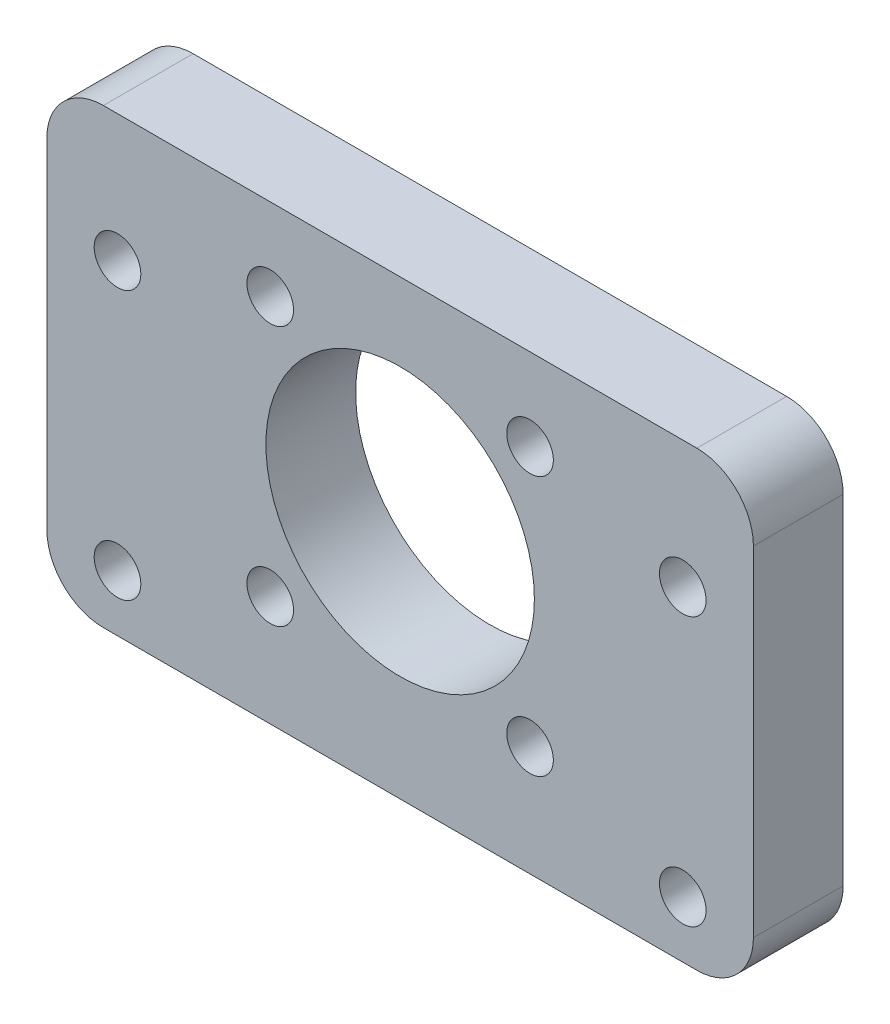
ISO-10303-21;
HEADER;
FILE_DESCRIPTION(('STEP AP214'),'2;1');
FILE_NAME('part.step','',(''),(''),'','','');
FILE_SCHEMA(('AUTOMOTIVE_DESIGN { 1 0 10303 214 1 1 1 1 }'));
ENDSEC;
DATA;
#1=APPLICATION_CONTEXT('core data for automotive mechanical design processes');
#2=APPLICATION_PROTOCOL_DEFINITION('international standard','automotive_design',2000,#1);
#3=PRODUCT_CONTEXT('',#1,'mechanical');
#4=PRODUCT('Part','Part','',(#3));
#5=PRODUCT_RELATED_PRODUCT_CATEGORY('part','',(#4));
#6=PRODUCT_DEFINITION_FORMATION('','',#4);
#7=PRODUCT_DEFINITION_CONTEXT('part definition',#1,'design');
#8=PRODUCT_DEFINITION('design','',#6,#7);
#9=PRODUCT_DEFINITION_SHAPE('','',#8);
#10=(LENGTH_UNIT() NAMED_UNIT(*) SI_UNIT(.MILLI.,.METRE.));
#11=(NAMED_UNIT(*) PLANE_ANGLE_UNIT() SI_UNIT($,.RADIAN.));
#12=(NAMED_UNIT(*) SI_UNIT($,.STERADIAN.) SOLID_ANGLE_UNIT());
#13=UNCERTAINTY_MEASURE_WITH_UNIT(LENGTH_MEASURE(1.E-05),#10,'distance_accuracy_value','');
#14=(GEOMETRIC_REPRESENTATION_CONTEXT(3) GLOBAL_UNCERTAINTY_ASSIGNED_CONTEXT((#13)) GLOBAL_UNIT_ASSIGNED_CONTEXT((#10,
#11,#12)) REPRESENTATION_CONTEXT('',''));
#15=CARTESIAN_POINT('',(0.,0.,0.));
#16=DIRECTION('',(0.,0.,1.));
#17=DIRECTION('',(1.,0.,0.));
#18=AXIS2_PLACEMENT_3D('',#15,#16,#17);
#19=CARTESIAN_POINT('',(0.,0.,6.35));
#20=DIRECTION('',(0.,0.,1.));
#21=DIRECTION('',(1.,0.,0.));
#22=AXIS2_PLACEMENT_3D('',#19,#20,#21);
#23=PLANE('',#22);
#24=CARTESIAN_POINT('',(20.,-13.,6.35));
#25=DIRECTION('',(0.,0.,1.));
#26=DIRECTION('',(1.,0.,0.));
#27=AXIS2_PLACEMENT_3D('',#24,#25,#26);
#28=CIRCLE('',#27,1.65);
#29=CARTESIAN_POINT('',(21.65,-13.,6.35));
#30=VERTEX_POINT('',#29);
#31=EDGE_CURVE('E229',#30,#30,#28,.T.);
#32=ORIENTED_EDGE('',*,*,#31,.F.);
#33=EDGE_LOOP('',(#32));
#34=FACE_BOUND('',#33,.T.);
#35=CARTESIAN_POINT('',(20.,6.00000000000001,6.35));
#36=DIRECTION('',(0.,0.,1.));
#37=DIRECTION('',(1.,0.,0.));
#38=AXIS2_PLACEMENT_3D('',#35,#36,#37);
#39=CIRCLE('',#38,1.65);
#40=CARTESIAN_POINT('',(21.65,6.00000000000001,6.35));
#41=VERTEX_POINT('',#40);
#42=EDGE_CURVE('E223',#41,#41,#39,.T.);
#43=ORIENTED_EDGE('',*,*,#42,.F.);
#44=EDGE_LOOP('',(#43));
#45=FACE_BOUND('',#44,.T.);
#46=CARTESIAN_POINT('',(-20.,-13.,6.35));
#47=DIRECTION('',(0.,0.,1.));
#48=DIRECTION('',(1.,0.,0.));
#49=AXIS2_PLACEMENT_3D('',#46,#47,#48);
#50=CIRCLE('',#49,1.65);
#51=CARTESIAN_POINT('',(-18.35,-13.,6.35));
#52=VERTEX_POINT('',#51);
#53=EDGE_CURVE('E217',#52,#52,#50,.T.);
#54=ORIENTED_EDGE('',*,*,#53,.F.);
#55=EDGE_LOOP('',(#54));
#56=FACE_BOUND('',#55,.T.);
#57=CARTESIAN_POINT('',(-20.,6.,6.35));
#58=DIRECTION('',(0.,0.,1.));
#59=DIRECTION('',(1.,0.,0.));
#60=AXIS2_PLACEMENT_3D('',#57,#58,#59);
#61=CIRCLE('',#60,1.65);
#62=CARTESIAN_POINT('',(-18.35,6.,6.35));
#63=VERTEX_POINT('',#62);
#64=EDGE_CURVE('E211',#63,#63,#61,.T.);
#65=ORIENTED_EDGE('',*,*,#64,.F.);
#66=EDGE_LOOP('',(#65));
#67=FACE_BOUND('',#66,.T.);
#68=CARTESIAN_POINT('',(9.19238815542512,-9.19238815542512,6.35));
#69=DIRECTION('',(0.,0.,1.));
#70=DIRECTION('',(1.,0.,0.));
#71=AXIS2_PLACEMENT_3D('',#68,#69,#70);
#72=CIRCLE('',#71,1.65);
#73=CARTESIAN_POINT('',(10.8423881554251,-9.19238815542512,6.35));
#74=VERTEX_POINT('',#73);
#75=EDGE_CURVE('E196',#74,#74,#72,.T.);
#76=ORIENTED_EDGE('',*,*,#75,.F.);
#77=EDGE_LOOP('',(#76));
#78=FACE_BOUND('',#77,.T.);
#79=CARTESIAN_POINT('',(-9.19238815542512,9.19238815542512,6.35));
#80=DIRECTION('',(0.,0.,1.));
#81=DIRECTION('',(1.,0.,0.));
#82=AXIS2_PLACEMENT_3D('',#79,#80,#81);
#83=CIRCLE('',#82,1.65);
#84=CARTESIAN_POINT('',(-7.54238815542512,9.19238815542512,6.35));
#85=VERTEX_POINT('',#84);
#86=EDGE_CURVE('E185',#85,#85,#83,.T.);
#87=ORIENTED_EDGE('',*,*,#86,.F.);
#88=EDGE_LOOP('',(#87));
#89=FACE_BOUND('',#88,.T.);
#90=DIRECTION('',(1.,0.,0.));
#91=VECTOR('',#90,1.);
#92=CARTESIAN_POINT('',(-25.,-17.,6.35));
#93=LINE('',#92,#91);
#94=CARTESIAN_POINT('',(-21.,-17.,6.35));
#95=VERTEX_POINT('',#94);
#96=CARTESIAN_POINT('',(21.,-17.,6.35));
#97=VERTEX_POINT('',#96);
#98=EDGE_CURVE('E170',#95,#97,#93,.T.);
#99=ORIENTED_EDGE('',*,*,#98,.T.);
#100=CARTESIAN_POINT('',(21.,-13.,6.35));
#101=DIRECTION('',(0.,0.,1.));
#102=DIRECTION('',(1.,0.,0.));
#103=AXIS2_PLACEMENT_3D('',#100,#101,#102);
#104=CIRCLE('',#103,4.);
#105=CARTESIAN_POINT('',(25.,-13.,6.35));
#106=VERTEX_POINT('',#105);
#107=EDGE_CURVE('E150',#97,#106,#104,.T.);
#108=ORIENTED_EDGE('',*,*,#107,.T.);
#109=DIRECTION('',(0.,1.,0.));
#110=VECTOR('',#109,1.);
#111=CARTESIAN_POINT('',(25.,15.,6.35));
#112=LINE('',#111,#110);
#113=CARTESIAN_POINT('',(25.,11.,6.35));
#114=VERTEX_POINT('',#113);
#115=EDGE_CURVE('E120',#106,#114,#112,.T.);
#116=ORIENTED_EDGE('',*,*,#115,.T.);
#117=CARTESIAN_POINT('',(21.,11.,6.35));
#118=DIRECTION('',(0.,0.,1.));
#119=DIRECTION('',(1.,0.,0.));
#120=AXIS2_PLACEMENT_3D('',#117,#118,#119);
#121=CIRCLE('',#120,4.);
#122=CARTESIAN_POINT('',(21.,15.,6.35));
#123=VERTEX_POINT('',#122);
#124=EDGE_CURVE('E56',#114,#123,#121,.T.);
#125=ORIENTED_EDGE('',*,*,#124,.T.);
#126=DIRECTION('',(-1.,0.,0.));
#127=VECTOR('',#126,1.);
#128=CARTESIAN_POINT('',(-25.,15.,6.35));
#129=LINE('',#128,#127);
#130=CARTESIAN_POINT('',(-21.,15.,6.35));
#131=VERTEX_POINT('',#130);
#132=EDGE_CURVE('E137',#123,#131,#129,.T.);
#133=ORIENTED_EDGE('',*,*,#132,.T.);
#134=CARTESIAN_POINT('',(-21.,11.,6.35));
#135=DIRECTION('',(0.,0.,1.));
#136=DIRECTION('',(1.,0.,0.));
#137=AXIS2_PLACEMENT_3D('',#134,#135,#136);
#138=CIRCLE('',#137,4.);
#139=CARTESIAN_POINT('',(-25.,11.,6.35));
#140=VERTEX_POINT('',#139);
#141=EDGE_CURVE('E145',#131,#140,#138,.T.);
#142=ORIENTED_EDGE('',*,*,#141,.T.);
#143=DIRECTION('',(0.,-1.,0.));
#144=VECTOR('',#143,1.);
#145=CARTESIAN_POINT('',(-25.,15.,6.35));
#146=LINE('',#145,#144);
#147=CARTESIAN_POINT('',(-25.,-13.,6.35));
#148=VERTEX_POINT('',#147);
#149=EDGE_CURVE('E131',#140,#148,#146,.T.);
#150=ORIENTED_EDGE('',*,*,#149,.T.);
#151=CARTESIAN_POINT('',(-21.,-13.,6.35));
#152=DIRECTION('',(0.,0.,1.));
#153=DIRECTION('',(1.,0.,0.));
#154=AXIS2_PLACEMENT_3D('',#151,#152,#153);
#155=CIRCLE('',#154,4.);
#156=EDGE_CURVE('E148',#148,#95,#155,.T.);
#157=ORIENTED_EDGE('',*,*,#156,.T.);
#158=EDGE_LOOP('',(#99,#108,#116,#125,#133,#142,#150,#157));
#159=FACE_BOUND('',#158,.T.);
#160=CARTESIAN_POINT('',(0.,0.,6.35));
#161=DIRECTION('',(0.,0.,1.));
#162=DIRECTION('',(1.,0.,0.));
#163=AXIS2_PLACEMENT_3D('',#160,#161,#162);
#164=CIRCLE('',#163,9.5);
#165=CARTESIAN_POINT('',(9.5,0.,6.35));
#166=VERTEX_POINT('',#165);
#167=EDGE_CURVE('E176',#166,#166,#164,.T.);
#168=ORIENTED_EDGE('',*,*,#167,.F.);
#169=EDGE_LOOP('',(#168));
#170=FACE_BOUND('',#169,.T.);
#171=CARTESIAN_POINT('',(9.19238815542512,9.19238815542512,6.35));
#172=DIRECTION('',(0.,0.,1.));
#173=DIRECTION('',(1.,0.,0.));
#174=AXIS2_PLACEMENT_3D('',#171,#172,#173);
#175=CIRCLE('',#174,1.65);
#176=CARTESIAN_POINT('',(10.8423881554251,9.19238815542512,6.35));
#177=VERTEX_POINT('',#176);
#178=EDGE_CURVE('E190',#177,#177,#175,.T.);
#179=ORIENTED_EDGE('',*,*,#178,.F.);
#180=EDGE_LOOP('',(#179));
#181=FACE_BOUND('',#180,.T.);
#182=CARTESIAN_POINT('',(-9.19238815542512,-9.19238815542512,6.35));
#183=DIRECTION('',(0.,0.,1.));
#184=DIRECTION('',(1.,0.,0.));
#185=AXIS2_PLACEMENT_3D('',#182,#183,#184);
#186=CIRCLE('',#185,1.65);
#187=CARTESIAN_POINT('',(-7.54238815542512,-9.19238815542512,6.35));
#188=VERTEX_POINT('',#187);
#189=EDGE_CURVE('E202',#188,#188,#186,.T.);
#190=ORIENTED_EDGE('',*,*,#189,.F.);
#191=EDGE_LOOP('',(#190));
#192=FACE_BOUND('',#191,.T.);
#193=ADVANCED_FACE('F35',(#34,#45,#56,#67,#78,#89,#159,#170,#181,#192),#23,.T.);
#194=CARTESIAN_POINT('',(0.,0.,0.));
#195=DIRECTION('',(0.,0.,1.));
#196=DIRECTION('',(1.,0.,0.));
#197=AXIS2_PLACEMENT_3D('',#194,#195,#196);
#198=PLANE('',#197);
#199=CARTESIAN_POINT('',(20.,-13.,0.));
#200=DIRECTION('',(0.,0.,1.));
#201=DIRECTION('',(1.,0.,0.));
#202=AXIS2_PLACEMENT_3D('',#199,#200,#201);
#203=CIRCLE('',#202,1.65);
#204=CARTESIAN_POINT('',(21.65,-13.,0.));
#205=VERTEX_POINT('',#204);
#206=EDGE_CURVE('E226',#205,#205,#203,.T.);
#207=ORIENTED_EDGE('',*,*,#206,.T.);
#208=EDGE_LOOP('',(#207));
#209=FACE_BOUND('',#208,.T.);
#210=CARTESIAN_POINT('',(20.,6.00000000000001,0.));
#211=DIRECTION('',(0.,0.,1.));
#212=DIRECTION('',(1.,0.,0.));
#213=AXIS2_PLACEMENT_3D('',#210,#211,#212);
#214=CIRCLE('',#213,1.65);
#215=CARTESIAN_POINT('',(21.65,6.00000000000001,0.));
#216=VERTEX_POINT('',#215);
#217=EDGE_CURVE('E220',#216,#216,#214,.T.);
#218=ORIENTED_EDGE('',*,*,#217,.T.);
#219=EDGE_LOOP('',(#218));
#220=FACE_BOUND('',#219,.T.);
#221=CARTESIAN_POINT('',(-20.,-13.,0.));
#222=DIRECTION('',(0.,0.,1.));
#223=DIRECTION('',(1.,0.,0.));
#224=AXIS2_PLACEMENT_3D('',#221,#222,#223);
#225=CIRCLE('',#224,1.65);
#226=CARTESIAN_POINT('',(-18.35,-13.,0.));
#227=VERTEX_POINT('',#226);
#228=EDGE_CURVE('E214',#227,#227,#225,.T.);
#229=ORIENTED_EDGE('',*,*,#228,.T.);
#230=EDGE_LOOP('',(#229));
#231=FACE_BOUND('',#230,.T.);
#232=CARTESIAN_POINT('',(-20.,6.,0.));
#233=DIRECTION('',(0.,0.,1.));
#234=DIRECTION('',(1.,0.,0.));
#235=AXIS2_PLACEMENT_3D('',#232,#233,#234);
#236=CIRCLE('',#235,1.65);
#237=CARTESIAN_POINT('',(-18.35,6.,0.));
#238=VERTEX_POINT('',#237);
#239=EDGE_CURVE('E208',#238,#238,#236,.T.);
#240=ORIENTED_EDGE('',*,*,#239,.T.);
#241=EDGE_LOOP('',(#240));
#242=FACE_BOUND('',#241,.T.);
#243=CARTESIAN_POINT('',(9.19238815542512,-9.19238815542512,0.));
#244=DIRECTION('',(0.,0.,1.));
#245=DIRECTION('',(1.,0.,0.));
#246=AXIS2_PLACEMENT_3D('',#243,#244,#245);
#247=CIRCLE('',#246,1.65);
#248=CARTESIAN_POINT('',(10.8423881554251,-9.19238815542512,0.));
#249=VERTEX_POINT('',#248);
#250=EDGE_CURVE('E199',#249,#249,#247,.T.);
#251=ORIENTED_EDGE('',*,*,#250,.T.);
#252=EDGE_LOOP('',(#251));
#253=FACE_BOUND('',#252,.T.);
#254=CARTESIAN_POINT('',(-9.19238815542512,9.19238815542512,0.));
#255=DIRECTION('',(0.,0.,1.));
#256=DIRECTION('',(1.,0.,0.));
#257=AXIS2_PLACEMENT_3D('',#254,#255,#256);
#258=CIRCLE('',#257,1.65);
#259=CARTESIAN_POINT('',(-7.54238815542512,9.19238815542512,0.));
#260=VERTEX_POINT('',#259);
#261=EDGE_CURVE('E187',#260,#260,#258,.T.);
#262=ORIENTED_EDGE('',*,*,#261,.T.);
#263=EDGE_LOOP('',(#262));
#264=FACE_BOUND('',#263,.T.);
#265=DIRECTION('',(0.,1.,0.));
#266=VECTOR('',#265,1.);
#267=CARTESIAN_POINT('',(25.,15.,0.));
#268=LINE('',#267,#266);
#269=CARTESIAN_POINT('',(25.,-13.,0.));
#270=VERTEX_POINT('',#269);
#271=CARTESIAN_POINT('',(25.,11.,0.));
#272=VERTEX_POINT('',#271);
#273=EDGE_CURVE('E118',#270,#272,#268,.T.);
#274=ORIENTED_EDGE('',*,*,#273,.F.);
#275=CARTESIAN_POINT('',(21.,-13.,0.));
#276=DIRECTION('',(0.,0.,1.));
#277=DIRECTION('',(1.,0.,0.));
#278=AXIS2_PLACEMENT_3D('',#275,#276,#277);
#279=CIRCLE('',#278,4.);
#280=CARTESIAN_POINT('',(21.,-17.,0.));
#281=VERTEX_POINT('',#280);
#282=EDGE_CURVE('E101',#270,#281,#279,.F.);
#283=ORIENTED_EDGE('',*,*,#282,.T.);
#284=DIRECTION('',(1.,0.,0.));
#285=VECTOR('',#284,1.);
#286=CARTESIAN_POINT('',(-25.,-17.,0.));
#287=LINE('',#286,#285);
#288=CARTESIAN_POINT('',(-21.,-17.,0.));
#289=VERTEX_POINT('',#288);
#290=EDGE_CURVE('E129',#289,#281,#287,.T.);
#291=ORIENTED_EDGE('',*,*,#290,.F.);
#292=CARTESIAN_POINT('',(-21.,-13.,0.));
#293=DIRECTION('',(0.,0.,1.));
#294=DIRECTION('',(1.,0.,0.));
#295=AXIS2_PLACEMENT_3D('',#292,#293,#294);
#296=CIRCLE('',#295,4.);
#297=CARTESIAN_POINT('',(-25.,-13.,0.));
#298=VERTEX_POINT('',#297);
#299=EDGE_CURVE('E112',#289,#298,#296,.F.);
#300=ORIENTED_EDGE('',*,*,#299,.T.);
#301=DIRECTION('',(0.,-1.,0.));
#302=VECTOR('',#301,1.);
#303=CARTESIAN_POINT('',(-25.,15.,0.));
#304=LINE('',#303,#302);
#305=CARTESIAN_POINT('',(-25.,11.,0.));
#306=VERTEX_POINT('',#305);
#307=EDGE_CURVE('E133',#306,#298,#304,.T.);
#308=ORIENTED_EDGE('',*,*,#307,.F.);
#309=CARTESIAN_POINT('',(-21.,11.,0.));
#310=DIRECTION('',(0.,0.,1.));
#311=DIRECTION('',(1.,0.,0.));
#312=AXIS2_PLACEMENT_3D('',#309,#310,#311);
#313=CIRCLE('',#312,4.);
#314=CARTESIAN_POINT('',(-21.,15.,0.));
#315=VERTEX_POINT('',#314);
#316=EDGE_CURVE('E121',#306,#315,#313,.F.);
#317=ORIENTED_EDGE('',*,*,#316,.T.);
#318=DIRECTION('',(-1.,0.,0.));
#319=VECTOR('',#318,1.);
#320=CARTESIAN_POINT('',(-25.,15.,0.));
#321=LINE('',#320,#319);
#322=CARTESIAN_POINT('',(21.,15.,0.));
#323=VERTEX_POINT('',#322);
#324=EDGE_CURVE('E128',#323,#315,#321,.T.);
#325=ORIENTED_EDGE('',*,*,#324,.F.);
#326=CARTESIAN_POINT('',(21.,11.,0.));
#327=DIRECTION('',(0.,0.,1.));
#328=DIRECTION('',(1.,0.,0.));
#329=AXIS2_PLACEMENT_3D('',#326,#327,#328);
#330=CIRCLE('',#329,4.);
#331=EDGE_CURVE('E127',#323,#272,#330,.F.);
#332=ORIENTED_EDGE('',*,*,#331,.T.);
#333=EDGE_LOOP('',(#274,#283,#291,#300,#308,#317,#325,#332));
#334=FACE_BOUND('',#333,.T.);
#335=CARTESIAN_POINT('',(0.,0.,0.));
#336=DIRECTION('',(0.,0.,1.));
#337=DIRECTION('',(1.,0.,0.));
#338=AXIS2_PLACEMENT_3D('',#335,#336,#337);
#339=CIRCLE('',#338,9.5);
#340=CARTESIAN_POINT('',(9.5,0.,0.));
#341=VERTEX_POINT('',#340);
#342=EDGE_CURVE('E178',#341,#341,#339,.T.);
#343=ORIENTED_EDGE('',*,*,#342,.T.);
#344=EDGE_LOOP('',(#343));
#345=FACE_BOUND('',#344,.T.);
#346=CARTESIAN_POINT('',(9.19238815542512,9.19238815542512,0.));
#347=DIRECTION('',(0.,0.,1.));
#348=DIRECTION('',(1.,0.,0.));
#349=AXIS2_PLACEMENT_3D('',#346,#347,#348);
#350=CIRCLE('',#349,1.65);
#351=CARTESIAN_POINT('',(10.8423881554251,9.19238815542512,0.));
#352=VERTEX_POINT('',#351);
#353=EDGE_CURVE('E193',#352,#352,#350,.T.);
#354=ORIENTED_EDGE('',*,*,#353,.T.);
#355=EDGE_LOOP('',(#354));
#356=FACE_BOUND('',#355,.T.);
#357=CARTESIAN_POINT('',(-9.19238815542512,-9.19238815542512,0.));
#358=DIRECTION('',(0.,0.,1.));
#359=DIRECTION('',(1.,0.,0.));
#360=AXIS2_PLACEMENT_3D('',#357,#358,#359);
#361=CIRCLE('',#360,1.65);
#362=CARTESIAN_POINT('',(-7.54238815542512,-9.19238815542512,0.));
#363=VERTEX_POINT('',#362);
#364=EDGE_CURVE('E205',#363,#363,#361,.T.);
#365=ORIENTED_EDGE('',*,*,#364,.T.);
#366=EDGE_LOOP('',(#365));
#367=FACE_BOUND('',#366,.T.);
#368=ADVANCED_FACE('F124',(#209,#220,#231,#242,#253,#264,#334,#345,#356,#367),#198,.F.);
#369=CARTESIAN_POINT('',(-25.,15.,6.35));
#370=DIRECTION('',(1.,0.,0.));
#371=DIRECTION('',(0.,1.,0.));
#372=AXIS2_PLACEMENT_3D('',#369,#370,#371);
#373=PLANE('',#372);
#374=ORIENTED_EDGE('',*,*,#307,.T.);
#375=DIRECTION('',(0.,0.,-1.));
#376=VECTOR('',#375,1.);
#377=CARTESIAN_POINT('',(-25.,-13.,6.35));
#378=LINE('',#377,#376);
#379=EDGE_CURVE('E155',#298,#148,#378,.F.);
#380=ORIENTED_EDGE('',*,*,#379,.T.);
#381=ORIENTED_EDGE('',*,*,#149,.F.);
#382=DIRECTION('',(0.,0.,-1.));
#383=VECTOR('',#382,1.);
#384=CARTESIAN_POINT('',(-25.,11.,6.35));
#385=LINE('',#384,#383);
#386=EDGE_CURVE('E152',#140,#306,#385,.T.);
#387=ORIENTED_EDGE('',*,*,#386,.T.);
#388=EDGE_LOOP('',(#374,#380,#381,#387));
#389=FACE_BOUND('',#388,.T.);
#390=ADVANCED_FACE('F161',(#389),#373,.F.);
#391=CARTESIAN_POINT('',(-25.,-17.,6.35));
#392=DIRECTION('',(0.,1.,0.));
#393=DIRECTION('',(-1.,0.,0.));
#394=AXIS2_PLACEMENT_3D('',#391,#392,#393);
#395=PLANE('',#394);
#396=ORIENTED_EDGE('',*,*,#290,.T.);
#397=DIRECTION('',(0.,0.,-1.));
#398=VECTOR('',#397,1.);
#399=CARTESIAN_POINT('',(21.,-17.,6.35));
#400=LINE('',#399,#398);
#401=EDGE_CURVE('E106',#281,#97,#400,.F.);
#402=ORIENTED_EDGE('',*,*,#401,.T.);
#403=ORIENTED_EDGE('',*,*,#98,.F.);
#404=DIRECTION('',(0.,0.,-1.));
#405=VECTOR('',#404,1.);
#406=CARTESIAN_POINT('',(-21.,-17.,6.35));
#407=LINE('',#406,#405);
#408=EDGE_CURVE('E111',#95,#289,#407,.T.);
#409=ORIENTED_EDGE('',*,*,#408,.T.);
#410=EDGE_LOOP('',(#396,#402,#403,#409));
#411=FACE_BOUND('',#410,.T.);
#412=ADVANCED_FACE('F175',(#411),#395,.F.);
#413=CARTESIAN_POINT('',(25.,15.,6.35));
#414=DIRECTION('',(-1.,0.,0.));
#415=DIRECTION('',(0.,-1.,0.));
#416=AXIS2_PLACEMENT_3D('',#413,#414,#415);
#417=PLANE('',#416);
#418=ORIENTED_EDGE('',*,*,#115,.F.);
#419=DIRECTION('',(0.,0.,-1.));
#420=VECTOR('',#419,1.);
#421=CARTESIAN_POINT('',(25.,-13.,6.35));
#422=LINE('',#421,#420);
#423=EDGE_CURVE('E105',#106,#270,#422,.T.);
#424=ORIENTED_EDGE('',*,*,#423,.T.);
#425=ORIENTED_EDGE('',*,*,#273,.T.);
#426=DIRECTION('',(0.,0.,-1.));
#427=VECTOR('',#426,1.);
#428=CARTESIAN_POINT('',(25.,11.,6.35));
#429=LINE('',#428,#427);
#430=EDGE_CURVE('E122',#272,#114,#429,.F.);
#431=ORIENTED_EDGE('',*,*,#430,.T.);
#432=EDGE_LOOP('',(#418,#424,#425,#431));
#433=FACE_BOUND('',#432,.T.);
#434=ADVANCED_FACE('F117',(#433),#417,.F.);
#435=CARTESIAN_POINT('',(-25.,15.,6.35));
#436=DIRECTION('',(0.,-1.,0.));
#437=DIRECTION('',(1.,0.,0.));
#438=AXIS2_PLACEMENT_3D('',#435,#436,#437);
#439=PLANE('',#438);
#440=ORIENTED_EDGE('',*,*,#132,.F.);
#441=DIRECTION('',(0.,0.,-1.));
#442=VECTOR('',#441,1.);
#443=CARTESIAN_POINT('',(21.,15.,6.35));
#444=LINE('',#443,#442);
#445=EDGE_CURVE('E11',#123,#323,#444,.T.);
#446=ORIENTED_EDGE('',*,*,#445,.T.);
#447=ORIENTED_EDGE('',*,*,#324,.T.);
#448=DIRECTION('',(0.,0.,-1.));
#449=VECTOR('',#448,1.);
#450=CARTESIAN_POINT('',(-21.,15.,6.35));
#451=LINE('',#450,#449);
#452=EDGE_CURVE('E43',#315,#131,#451,.F.);
#453=ORIENTED_EDGE('',*,*,#452,.T.);
#454=EDGE_LOOP('',(#440,#446,#447,#453));
#455=FACE_BOUND('',#454,.T.);
#456=ADVANCED_FACE('F273',(#455),#439,.F.);
#457=CARTESIAN_POINT('',(0.,0.,6.35));
#458=DIRECTION('',(0.,0.,-1.));
#459=DIRECTION('',(-1.,0.,0.));
#460=AXIS2_PLACEMENT_3D('',#457,#458,#459);
#461=CYLINDRICAL_SURFACE('',#460,9.5);
#462=ORIENTED_EDGE('',*,*,#167,.T.);
#463=EDGE_LOOP('',(#462));
#464=FACE_BOUND('',#463,.T.);
#465=ORIENTED_EDGE('',*,*,#342,.F.);
#466=EDGE_LOOP('',(#465));
#467=FACE_BOUND('',#466,.T.);
#468=ADVANCED_FACE('F261',(#464,#467),#461,.F.);
#469=CARTESIAN_POINT('',(-9.19238815542512,9.19238815542512,6.35));
#470=DIRECTION('',(0.,0.,-1.));
#471=DIRECTION('',(-1.,0.,0.));
#472=AXIS2_PLACEMENT_3D('',#469,#470,#471);
#473=CYLINDRICAL_SURFACE('',#472,1.65);
#474=ORIENTED_EDGE('',*,*,#86,.T.);
#475=EDGE_LOOP('',(#474));
#476=FACE_BOUND('',#475,.T.);
#477=ORIENTED_EDGE('',*,*,#261,.F.);
#478=EDGE_LOOP('',(#477));
#479=FACE_BOUND('',#478,.T.);
#480=ADVANCED_FACE('F257',(#476,#479),#473,.F.);
#481=CARTESIAN_POINT('',(9.19238815542512,9.19238815542512,6.35));
#482=DIRECTION('',(0.,0.,-1.));
#483=DIRECTION('',(-1.,0.,0.));
#484=AXIS2_PLACEMENT_3D('',#481,#482,#483);
#485=CYLINDRICAL_SURFACE('',#484,1.65);
#486=ORIENTED_EDGE('',*,*,#178,.T.);
#487=EDGE_LOOP('',(#486));
#488=FACE_BOUND('',#487,.T.);
#489=ORIENTED_EDGE('',*,*,#353,.F.);
#490=EDGE_LOOP('',(#489));
#491=FACE_BOUND('',#490,.T.);
#492=ADVANCED_FACE('F260',(#488,#491),#485,.F.);
#493=CARTESIAN_POINT('',(9.19238815542512,-9.19238815542512,6.35));
#494=DIRECTION('',(0.,0.,-1.));
#495=DIRECTION('',(-1.,0.,0.));
#496=AXIS2_PLACEMENT_3D('',#493,#494,#495);
#497=CYLINDRICAL_SURFACE('',#496,1.65);
#498=ORIENTED_EDGE('',*,*,#75,.T.);
#499=EDGE_LOOP('',(#498));
#500=FACE_BOUND('',#499,.T.);
#501=ORIENTED_EDGE('',*,*,#250,.F.);
#502=EDGE_LOOP('',(#501));
#503=FACE_BOUND('',#502,.T.);
#504=ADVANCED_FACE('F390',(#500,#503),#497,.F.);
#505=CARTESIAN_POINT('',(-9.19238815542512,-9.19238815542512,6.35));
#506=DIRECTION('',(0.,0.,-1.));
#507=DIRECTION('',(-1.,0.,0.));
#508=AXIS2_PLACEMENT_3D('',#505,#506,#507);
#509=CYLINDRICAL_SURFACE('',#508,1.65);
#510=ORIENTED_EDGE('',*,*,#189,.T.);
#511=EDGE_LOOP('',(#510));
#512=FACE_BOUND('',#511,.T.);
#513=ORIENTED_EDGE('',*,*,#364,.F.);
#514=EDGE_LOOP('',(#513));
#515=FACE_BOUND('',#514,.T.);
#516=ADVANCED_FACE('F380',(#512,#515),#509,.F.);
#517=CARTESIAN_POINT('',(-20.,6.,0.));
#518=DIRECTION('',(0.,0.,1.));
#519=DIRECTION('',(1.,0.,0.));
#520=AXIS2_PLACEMENT_3D('',#517,#518,#519);
#521=CYLINDRICAL_SURFACE('',#520,1.65);
#522=ORIENTED_EDGE('',*,*,#239,.F.);
#523=EDGE_LOOP('',(#522));
#524=FACE_BOUND('',#523,.T.);
#525=ORIENTED_EDGE('',*,*,#64,.T.);
#526=EDGE_LOOP('',(#525));
#527=FACE_BOUND('',#526,.T.);
#528=ADVANCED_FACE('F370',(#524,#527),#521,.F.);
#529=CARTESIAN_POINT('',(-20.,-13.,0.));
#530=DIRECTION('',(0.,0.,1.));
#531=DIRECTION('',(1.,0.,0.));
#532=AXIS2_PLACEMENT_3D('',#529,#530,#531);
#533=CYLINDRICAL_SURFACE('',#532,1.65);
#534=ORIENTED_EDGE('',*,*,#228,.F.);
#535=EDGE_LOOP('',(#534));
#536=FACE_BOUND('',#535,.T.);
#537=ORIENTED_EDGE('',*,*,#53,.T.);
#538=EDGE_LOOP('',(#537));
#539=FACE_BOUND('',#538,.T.);
#540=ADVANCED_FACE('F360',(#536,#539),#533,.F.);
#541=CARTESIAN_POINT('',(20.,6.00000000000001,0.));
#542=DIRECTION('',(0.,0.,1.));
#543=DIRECTION('',(1.,0.,0.));
#544=AXIS2_PLACEMENT_3D('',#541,#542,#543);
#545=CYLINDRICAL_SURFACE('',#544,1.65);
#546=ORIENTED_EDGE('',*,*,#217,.F.);
#547=EDGE_LOOP('',(#546));
#548=FACE_BOUND('',#547,.T.);
#549=ORIENTED_EDGE('',*,*,#42,.T.);
#550=EDGE_LOOP('',(#549));
#551=FACE_BOUND('',#550,.T.);
#552=ADVANCED_FACE('F240',(#548,#551),#545,.F.);
#553=CARTESIAN_POINT('',(20.,-13.,0.));
#554=DIRECTION('',(0.,0.,1.));
#555=DIRECTION('',(1.,0.,0.));
#556=AXIS2_PLACEMENT_3D('',#553,#554,#555);
#557=CYLINDRICAL_SURFACE('',#556,1.65);
#558=ORIENTED_EDGE('',*,*,#206,.F.);
#559=EDGE_LOOP('',(#558));
#560=FACE_BOUND('',#559,.T.);
#561=ORIENTED_EDGE('',*,*,#31,.T.);
#562=EDGE_LOOP('',(#561));
#563=FACE_BOUND('',#562,.T.);
#564=ADVANCED_FACE('F237',(#560,#563),#557,.F.);
#565=CARTESIAN_POINT('',(21.,-13.,6.35));
#566=DIRECTION('',(0.,0.,-1.));
#567=DIRECTION('',(-1.,0.,0.));
#568=AXIS2_PLACEMENT_3D('',#565,#566,#567);
#569=CYLINDRICAL_SURFACE('',#568,4.);
#570=ORIENTED_EDGE('',*,*,#107,.F.);
#571=ORIENTED_EDGE('',*,*,#401,.F.);
#572=ORIENTED_EDGE('',*,*,#282,.F.);
#573=ORIENTED_EDGE('',*,*,#423,.F.);
#574=EDGE_LOOP('',(#570,#571,#572,#573));
#575=FACE_BOUND('',#574,.T.);
#576=ADVANCED_FACE('F104',(#575),#569,.T.);
#577=CARTESIAN_POINT('',(-21.,-13.,6.35));
#578=DIRECTION('',(0.,0.,-1.));
#579=DIRECTION('',(-1.,0.,0.));
#580=AXIS2_PLACEMENT_3D('',#577,#578,#579);
#581=CYLINDRICAL_SURFACE('',#580,4.);
#582=ORIENTED_EDGE('',*,*,#156,.F.);
#583=ORIENTED_EDGE('',*,*,#379,.F.);
#584=ORIENTED_EDGE('',*,*,#299,.F.);
#585=ORIENTED_EDGE('',*,*,#408,.F.);
#586=EDGE_LOOP('',(#582,#583,#584,#585));
#587=FACE_BOUND('',#586,.T.);
#588=ADVANCED_FACE('F173',(#587),#581,.T.);
#589=CARTESIAN_POINT('',(21.,11.,6.35));
#590=DIRECTION('',(0.,0.,-1.));
#591=DIRECTION('',(-1.,0.,0.));
#592=AXIS2_PLACEMENT_3D('',#589,#590,#591);
#593=CYLINDRICAL_SURFACE('',#592,4.);
#594=ORIENTED_EDGE('',*,*,#124,.F.);
#595=ORIENTED_EDGE('',*,*,#430,.F.);
#596=ORIENTED_EDGE('',*,*,#331,.F.);
#597=ORIENTED_EDGE('',*,*,#445,.F.);
#598=EDGE_LOOP('',(#594,#595,#596,#597));
#599=FACE_BOUND('',#598,.T.);
#600=ADVANCED_FACE('F283',(#599),#593,.T.);
#601=CARTESIAN_POINT('',(-21.,11.,6.35));
#602=DIRECTION('',(0.,0.,-1.));
#603=DIRECTION('',(-1.,0.,0.));
#604=AXIS2_PLACEMENT_3D('',#601,#602,#603);
#605=CYLINDRICAL_SURFACE('',#604,4.);
#606=ORIENTED_EDGE('',*,*,#141,.F.);
#607=ORIENTED_EDGE('',*,*,#452,.F.);
#608=ORIENTED_EDGE('',*,*,#316,.F.);
#609=ORIENTED_EDGE('',*,*,#386,.F.);
#610=EDGE_LOOP('',(#606,#607,#608,#609));
#611=FACE_BOUND('',#610,.T.);
#612=ADVANCED_FACE('F37',(#611),#605,.T.);
#613=CLOSED_SHELL('',(#193,#368,#390,#412,#434,#456,#468,#480,#492,#504,#516,#528,#540,#552,
#564,#576,#588,#600,#612));
#614=MANIFOLD_SOLID_BREP('B2',#613);
#615=ADVANCED_BREP_SHAPE_REPRESENTATION('',(#18,#614),#14);
#616=SHAPE_DEFINITION_REPRESENTATION(#9,#615);
ENDSEC;
END-ISO-10303-21;
